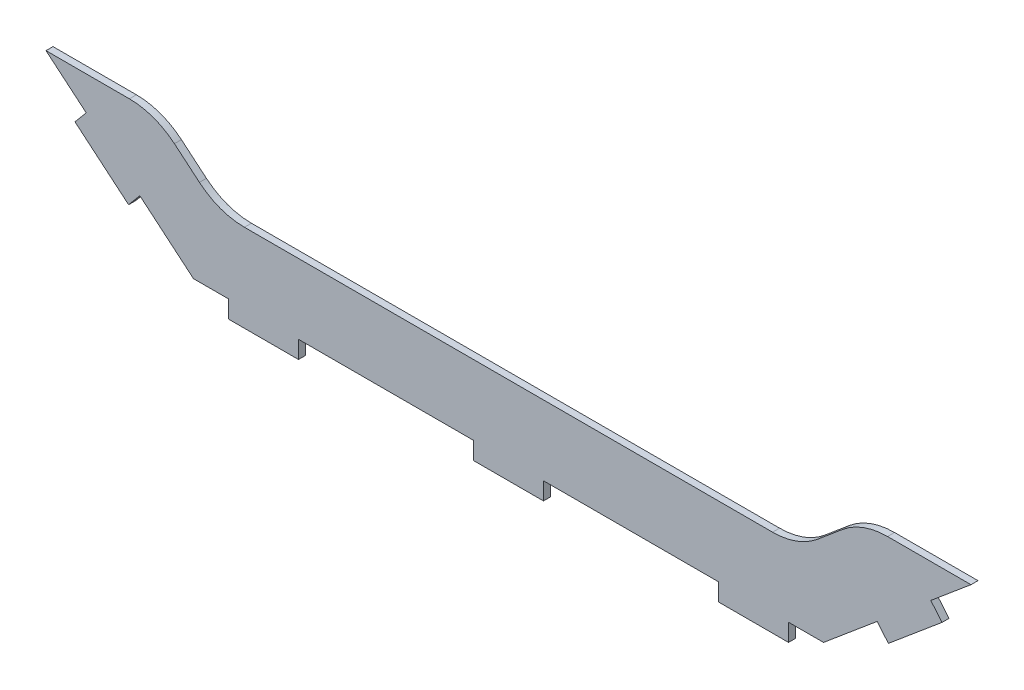
ISO-10303-21;
HEADER;
FILE_DESCRIPTION(('STEP AP214'),'2;1');
FILE_NAME('part.step','',(''),(''),'','','');
FILE_SCHEMA(('AUTOMOTIVE_DESIGN { 1 0 10303 214 1 1 1 1 }'));
ENDSEC;
DATA;
#1=APPLICATION_CONTEXT('core data for automotive mechanical design processes');
#2=APPLICATION_PROTOCOL_DEFINITION('international standard','automotive_design',2000,#1);
#3=PRODUCT_CONTEXT('',#1,'mechanical');
#4=PRODUCT('Part','Part','',(#3));
#5=PRODUCT_RELATED_PRODUCT_CATEGORY('part','',(#4));
#6=PRODUCT_DEFINITION_FORMATION('','',#4);
#7=PRODUCT_DEFINITION_CONTEXT('part definition',#1,'design');
#8=PRODUCT_DEFINITION('design','',#6,#7);
#9=PRODUCT_DEFINITION_SHAPE('','',#8);
#10=(LENGTH_UNIT() NAMED_UNIT(*) SI_UNIT(.MILLI.,.METRE.));
#11=(NAMED_UNIT(*) PLANE_ANGLE_UNIT() SI_UNIT($,.RADIAN.));
#12=(NAMED_UNIT(*) SI_UNIT($,.STERADIAN.) SOLID_ANGLE_UNIT());
#13=UNCERTAINTY_MEASURE_WITH_UNIT(LENGTH_MEASURE(1.E-05),#10,'distance_accuracy_value','');
#14=(GEOMETRIC_REPRESENTATION_CONTEXT(3) GLOBAL_UNCERTAINTY_ASSIGNED_CONTEXT((#13)) GLOBAL_UNIT_ASSIGNED_CONTEXT((#10,
#11,#12)) REPRESENTATION_CONTEXT('',''));
#15=CARTESIAN_POINT('',(0.,0.,0.));
#16=DIRECTION('',(0.,0.,1.));
#17=DIRECTION('',(1.,0.,0.));
#18=AXIS2_PLACEMENT_3D('',#15,#16,#17);
#19=CARTESIAN_POINT('',(0.5,-0.25,0.05));
#20=DIRECTION('',(-1.,0.,0.));
#21=DIRECTION('',(0.,0.,1.));
#22=AXIS2_PLACEMENT_3D('',#19,#20,#21);
#23=PLANE('',#22);
#24=DIRECTION('',(0.,1.,0.));
#25=VECTOR('',#24,1.);
#26=CARTESIAN_POINT('',(0.5,-0.25,-0.05));
#27=LINE('',#26,#25);
#28=CARTESIAN_POINT('',(0.5,-0.25,-0.05));
#29=VERTEX_POINT('',#28);
#30=CARTESIAN_POINT('',(0.5,0.,-0.05));
#31=VERTEX_POINT('',#30);
#32=EDGE_CURVE('E324',#29,#31,#27,.T.);
#33=ORIENTED_EDGE('',*,*,#32,.T.);
#34=DIRECTION('',(0.,0.,-1.));
#35=VECTOR('',#34,1.);
#36=CARTESIAN_POINT('',(0.5,0.,0.05));
#37=LINE('',#36,#35);
#38=CARTESIAN_POINT('',(0.5,0.,0.05));
#39=VERTEX_POINT('',#38);
#40=EDGE_CURVE('E303',#39,#31,#37,.T.);
#41=ORIENTED_EDGE('',*,*,#40,.F.);
#42=DIRECTION('',(0.,1.,0.));
#43=VECTOR('',#42,1.);
#44=CARTESIAN_POINT('',(0.5,-0.25,0.05));
#45=LINE('',#44,#43);
#46=CARTESIAN_POINT('',(0.5,-0.25,0.05));
#47=VERTEX_POINT('',#46);
#48=EDGE_CURVE('E310',#47,#39,#45,.T.);
#49=ORIENTED_EDGE('',*,*,#48,.F.);
#50=DIRECTION('',(0.,0.,-1.));
#51=VECTOR('',#50,1.);
#52=CARTESIAN_POINT('',(0.5,-0.25,0.05));
#53=LINE('',#52,#51);
#54=EDGE_CURVE('E454',#47,#29,#53,.T.);
#55=ORIENTED_EDGE('',*,*,#54,.T.);
#56=EDGE_LOOP('',(#33,#41,#49,#55));
#57=FACE_BOUND('',#56,.T.);
#58=ADVANCED_FACE('F39',(#57),#23,.F.);
#59=CARTESIAN_POINT('',(0.5,0.,0.05));
#60=DIRECTION('',(0.,1.,0.));
#61=DIRECTION('',(0.,0.,1.));
#62=AXIS2_PLACEMENT_3D('',#59,#60,#61);
#63=PLANE('',#62);
#64=DIRECTION('',(1.,0.,0.));
#65=VECTOR('',#64,1.);
#66=CARTESIAN_POINT('',(0.5,0.,-0.05));
#67=LINE('',#66,#65);
#68=CARTESIAN_POINT('',(3.,0.,-0.05));
#69=VERTEX_POINT('',#68);
#70=EDGE_CURVE('E456',#31,#69,#67,.T.);
#71=ORIENTED_EDGE('',*,*,#70,.T.);
#72=DIRECTION('',(0.,0.,-1.));
#73=VECTOR('',#72,1.);
#74=CARTESIAN_POINT('',(3.,0.,0.05));
#75=LINE('',#74,#73);
#76=CARTESIAN_POINT('',(3.,0.,0.05));
#77=VERTEX_POINT('',#76);
#78=EDGE_CURVE('E306',#77,#69,#75,.T.);
#79=ORIENTED_EDGE('',*,*,#78,.F.);
#80=DIRECTION('',(1.,0.,0.));
#81=VECTOR('',#80,1.);
#82=CARTESIAN_POINT('',(0.5,0.,0.05));
#83=LINE('',#82,#81);
#84=EDGE_CURVE('E299',#39,#77,#83,.T.);
#85=ORIENTED_EDGE('',*,*,#84,.F.);
#86=ORIENTED_EDGE('',*,*,#40,.T.);
#87=EDGE_LOOP('',(#71,#79,#85,#86));
#88=FACE_BOUND('',#87,.T.);
#89=ADVANCED_FACE('F301',(#88),#63,.F.);
#90=CARTESIAN_POINT('',(3.,0.,0.05));
#91=DIRECTION('',(1.,0.,0.));
#92=DIRECTION('',(0.,0.,-1.));
#93=AXIS2_PLACEMENT_3D('',#90,#91,#92);
#94=PLANE('',#93);
#95=DIRECTION('',(0.,-1.,0.));
#96=VECTOR('',#95,1.);
#97=CARTESIAN_POINT('',(3.,0.,-0.05));
#98=LINE('',#97,#96);
#99=CARTESIAN_POINT('',(3.,-0.25,-0.05));
#100=VERTEX_POINT('',#99);
#101=EDGE_CURVE('E459',#69,#100,#98,.T.);
#102=ORIENTED_EDGE('',*,*,#101,.T.);
#103=DIRECTION('',(0.,0.,-1.));
#104=VECTOR('',#103,1.);
#105=CARTESIAN_POINT('',(3.,-0.25,0.05));
#106=LINE('',#105,#104);
#107=CARTESIAN_POINT('',(3.,-0.25,0.05));
#108=VERTEX_POINT('',#107);
#109=EDGE_CURVE('E334',#108,#100,#106,.T.);
#110=ORIENTED_EDGE('',*,*,#109,.F.);
#111=DIRECTION('',(0.,-1.,0.));
#112=VECTOR('',#111,1.);
#113=CARTESIAN_POINT('',(3.,0.,0.05));
#114=LINE('',#113,#112);
#115=EDGE_CURVE('E309',#77,#108,#114,.T.);
#116=ORIENTED_EDGE('',*,*,#115,.F.);
#117=ORIENTED_EDGE('',*,*,#78,.T.);
#118=EDGE_LOOP('',(#102,#110,#116,#117));
#119=FACE_BOUND('',#118,.T.);
#120=ADVANCED_FACE('F701',(#119),#94,.F.);
#121=CARTESIAN_POINT('',(3.,-0.25,0.05));
#122=DIRECTION('',(0.,1.,0.));
#123=DIRECTION('',(0.,0.,1.));
#124=AXIS2_PLACEMENT_3D('',#121,#122,#123);
#125=PLANE('',#124);
#126=DIRECTION('',(1.,0.,0.));
#127=VECTOR('',#126,1.);
#128=CARTESIAN_POINT('',(3.,-0.25,-0.05));
#129=LINE('',#128,#127);
#130=CARTESIAN_POINT('',(4.,-0.25,-0.05));
#131=VERTEX_POINT('',#130);
#132=EDGE_CURVE('E462',#100,#131,#129,.T.);
#133=ORIENTED_EDGE('',*,*,#132,.T.);
#134=DIRECTION('',(0.,0.,-1.));
#135=VECTOR('',#134,1.);
#136=CARTESIAN_POINT('',(4.,-0.25,0.05));
#137=LINE('',#136,#135);
#138=CARTESIAN_POINT('',(4.,-0.25,0.05));
#139=VERTEX_POINT('',#138);
#140=EDGE_CURVE('E597',#139,#131,#137,.T.);
#141=ORIENTED_EDGE('',*,*,#140,.F.);
#142=DIRECTION('',(1.,0.,0.));
#143=VECTOR('',#142,1.);
#144=CARTESIAN_POINT('',(3.,-0.25,0.05));
#145=LINE('',#144,#143);
#146=EDGE_CURVE('E608',#108,#139,#145,.T.);
#147=ORIENTED_EDGE('',*,*,#146,.F.);
#148=ORIENTED_EDGE('',*,*,#109,.T.);
#149=EDGE_LOOP('',(#133,#141,#147,#148));
#150=FACE_BOUND('',#149,.T.);
#151=ADVANCED_FACE('F606',(#150),#125,.F.);
#152=CARTESIAN_POINT('',(4.,-0.25,0.05));
#153=DIRECTION('',(-1.,0.,0.));
#154=DIRECTION('',(0.,0.,1.));
#155=AXIS2_PLACEMENT_3D('',#152,#153,#154);
#156=PLANE('',#155);
#157=DIRECTION('',(0.,1.,0.));
#158=VECTOR('',#157,1.);
#159=CARTESIAN_POINT('',(4.,-0.25,-0.05));
#160=LINE('',#159,#158);
#161=CARTESIAN_POINT('',(4.,0.,-0.05));
#162=VERTEX_POINT('',#161);
#163=EDGE_CURVE('E465',#131,#162,#160,.T.);
#164=ORIENTED_EDGE('',*,*,#163,.T.);
#165=DIRECTION('',(0.,0.,-1.));
#166=VECTOR('',#165,1.);
#167=CARTESIAN_POINT('',(4.,0.,0.05));
#168=LINE('',#167,#166);
#169=CARTESIAN_POINT('',(4.,0.,0.05));
#170=VERTEX_POINT('',#169);
#171=EDGE_CURVE('E593',#170,#162,#168,.T.);
#172=ORIENTED_EDGE('',*,*,#171,.F.);
#173=DIRECTION('',(0.,1.,0.));
#174=VECTOR('',#173,1.);
#175=CARTESIAN_POINT('',(4.,-0.25,0.05));
#176=LINE('',#175,#174);
#177=EDGE_CURVE('E626',#139,#170,#176,.T.);
#178=ORIENTED_EDGE('',*,*,#177,.F.);
#179=ORIENTED_EDGE('',*,*,#140,.T.);
#180=EDGE_LOOP('',(#164,#172,#178,#179));
#181=FACE_BOUND('',#180,.T.);
#182=ADVANCED_FACE('F616',(#181),#156,.F.);
#183=CARTESIAN_POINT('',(4.,0.,0.05));
#184=DIRECTION('',(0.,1.,0.));
#185=DIRECTION('',(0.,0.,1.));
#186=AXIS2_PLACEMENT_3D('',#183,#184,#185);
#187=PLANE('',#186);
#188=DIRECTION('',(1.,0.,0.));
#189=VECTOR('',#188,1.);
#190=CARTESIAN_POINT('',(4.,0.,-0.05));
#191=LINE('',#190,#189);
#192=CARTESIAN_POINT('',(4.5,0.,-0.05));
#193=VERTEX_POINT('',#192);
#194=EDGE_CURVE('E468',#162,#193,#191,.T.);
#195=ORIENTED_EDGE('',*,*,#194,.T.);
#196=DIRECTION('',(0.,0.,-1.));
#197=VECTOR('',#196,1.);
#198=CARTESIAN_POINT('',(4.5,0.,0.05));
#199=LINE('',#198,#197);
#200=CARTESIAN_POINT('',(4.5,0.,0.05));
#201=VERTEX_POINT('',#200);
#202=EDGE_CURVE('E589',#201,#193,#199,.T.);
#203=ORIENTED_EDGE('',*,*,#202,.F.);
#204=DIRECTION('',(1.,0.,0.));
#205=VECTOR('',#204,1.);
#206=CARTESIAN_POINT('',(4.,0.,0.05));
#207=LINE('',#206,#205);
#208=EDGE_CURVE('E622',#170,#201,#207,.T.);
#209=ORIENTED_EDGE('',*,*,#208,.F.);
#210=ORIENTED_EDGE('',*,*,#171,.T.);
#211=EDGE_LOOP('',(#195,#203,#209,#210));
#212=FACE_BOUND('',#211,.T.);
#213=ADVANCED_FACE('F620',(#212),#187,.F.);
#214=CARTESIAN_POINT('',(4.5,0.,0.05));
#215=DIRECTION('',(-0.64278760968654,0.766044443118977,0.));
#216=DIRECTION('',(-0.766044443118977,-0.64278760968654,0.));
#217=AXIS2_PLACEMENT_3D('',#214,#215,#216);
#218=PLANE('',#217);
#219=DIRECTION('',(0.766044443118977,0.64278760968654,0.));
#220=VECTOR('',#219,1.);
#221=CARTESIAN_POINT('',(4.5,0.,-0.05));
#222=LINE('',#221,#220);
#223=CARTESIAN_POINT('',(5.26604444311898,0.642787609686539,-0.05));
#224=VERTEX_POINT('',#223);
#225=EDGE_CURVE('E471',#193,#224,#222,.T.);
#226=ORIENTED_EDGE('',*,*,#225,.T.);
#227=DIRECTION('',(0.,0.,-1.));
#228=VECTOR('',#227,1.);
#229=CARTESIAN_POINT('',(5.26604444311898,0.642787609686539,0.05));
#230=LINE('',#229,#228);
#231=CARTESIAN_POINT('',(5.26604444311898,0.642787609686539,0.05));
#232=VERTEX_POINT('',#231);
#233=EDGE_CURVE('E585',#232,#224,#230,.T.);
#234=ORIENTED_EDGE('',*,*,#233,.F.);
#235=DIRECTION('',(0.766044443118977,0.64278760968654,0.));
#236=VECTOR('',#235,1.);
#237=CARTESIAN_POINT('',(4.5,0.,0.05));
#238=LINE('',#237,#236);
#239=EDGE_CURVE('E625',#201,#232,#238,.T.);
#240=ORIENTED_EDGE('',*,*,#239,.F.);
#241=ORIENTED_EDGE('',*,*,#202,.T.);
#242=EDGE_LOOP('',(#226,#234,#240,#241));
#243=FACE_BOUND('',#242,.T.);
#244=ADVANCED_FACE('F687',(#243),#218,.F.);
#245=CARTESIAN_POINT('',(5.26604444311898,0.642787609686539,0.05));
#246=DIRECTION('',(0.766044443118977,0.642787609686541,0.));
#247=DIRECTION('',(-0.642787609686541,0.766044443118977,0.));
#248=AXIS2_PLACEMENT_3D('',#245,#246,#247);
#249=PLANE('',#248);
#250=DIRECTION('',(0.642787609686541,-0.766044443118977,0.));
#251=VECTOR('',#250,1.);
#252=CARTESIAN_POINT('',(5.26604444311898,0.642787609686539,-0.05));
#253=LINE('',#252,#251);
#254=CARTESIAN_POINT('',(5.42674134554061,0.451276498906795,-0.05));
#255=VERTEX_POINT('',#254);
#256=EDGE_CURVE('E474',#224,#255,#253,.T.);
#257=ORIENTED_EDGE('',*,*,#256,.T.);
#258=DIRECTION('',(0.,0.,-1.));
#259=VECTOR('',#258,1.);
#260=CARTESIAN_POINT('',(5.42674134554061,0.451276498906795,0.05));
#261=LINE('',#260,#259);
#262=CARTESIAN_POINT('',(5.42674134554061,0.451276498906795,0.05));
#263=VERTEX_POINT('',#262);
#264=EDGE_CURVE('E581',#263,#255,#261,.T.);
#265=ORIENTED_EDGE('',*,*,#264,.F.);
#266=DIRECTION('',(0.642787609686541,-0.766044443118977,0.));
#267=VECTOR('',#266,1.);
#268=CARTESIAN_POINT('',(5.26604444311898,0.642787609686539,0.05));
#269=LINE('',#268,#267);
#270=EDGE_CURVE('E629',#232,#263,#269,.T.);
#271=ORIENTED_EDGE('',*,*,#270,.F.);
#272=ORIENTED_EDGE('',*,*,#233,.T.);
#273=EDGE_LOOP('',(#257,#265,#271,#272));
#274=FACE_BOUND('',#273,.T.);
#275=ADVANCED_FACE('F684',(#274),#249,.F.);
#276=CARTESIAN_POINT('',(5.42674134554061,0.451276498906795,0.05));
#277=DIRECTION('',(-0.64278760968654,0.766044443118977,0.));
#278=DIRECTION('',(-0.766044443118977,-0.64278760968654,0.));
#279=AXIS2_PLACEMENT_3D('',#276,#277,#278);
#280=PLANE('',#279);
#281=DIRECTION('',(0.766044443118977,0.64278760968654,0.));
#282=VECTOR('',#281,1.);
#283=CARTESIAN_POINT('',(5.42674134554061,0.451276498906795,-0.05));
#284=LINE('',#283,#282);
#285=CARTESIAN_POINT('',(6.19278578865959,1.09406410859334,-0.05));
#286=VERTEX_POINT('',#285);
#287=EDGE_CURVE('E477',#255,#286,#284,.T.);
#288=ORIENTED_EDGE('',*,*,#287,.T.);
#289=DIRECTION('',(0.,0.,-1.));
#290=VECTOR('',#289,1.);
#291=CARTESIAN_POINT('',(6.19278578865959,1.09406410859334,0.05));
#292=LINE('',#291,#290);
#293=CARTESIAN_POINT('',(6.19278578865959,1.09406410859334,0.05));
#294=VERTEX_POINT('',#293);
#295=EDGE_CURVE('E577',#294,#286,#292,.T.);
#296=ORIENTED_EDGE('',*,*,#295,.F.);
#297=DIRECTION('',(0.766044443118977,0.64278760968654,0.));
#298=VECTOR('',#297,1.);
#299=CARTESIAN_POINT('',(5.42674134554061,0.451276498906795,0.05));
#300=LINE('',#299,#298);
#301=EDGE_CURVE('E637',#263,#294,#300,.T.);
#302=ORIENTED_EDGE('',*,*,#301,.F.);
#303=ORIENTED_EDGE('',*,*,#264,.T.);
#304=EDGE_LOOP('',(#288,#296,#302,#303));
#305=FACE_BOUND('',#304,.T.);
#306=ADVANCED_FACE('F680',(#305),#280,.F.);
#307=CARTESIAN_POINT('',(6.19278578865959,1.09406410859334,0.05));
#308=DIRECTION('',(-0.766044443118978,-0.64278760968654,0.));
#309=DIRECTION('',(0.64278760968654,-0.766044443118978,0.));
#310=AXIS2_PLACEMENT_3D('',#307,#308,#309);
#311=PLANE('',#310);
#312=DIRECTION('',(-0.64278760968654,0.766044443118978,0.));
#313=VECTOR('',#312,1.);
#314=CARTESIAN_POINT('',(6.19278578865959,1.09406410859334,-0.05));
#315=LINE('',#314,#313);
#316=CARTESIAN_POINT('',(6.03208888623795,1.28557521937308,-0.05));
#317=VERTEX_POINT('',#316);
#318=EDGE_CURVE('E480',#286,#317,#315,.T.);
#319=ORIENTED_EDGE('',*,*,#318,.T.);
#320=DIRECTION('',(0.,0.,-1.));
#321=VECTOR('',#320,1.);
#322=CARTESIAN_POINT('',(6.03208888623795,1.28557521937308,0.05));
#323=LINE('',#322,#321);
#324=CARTESIAN_POINT('',(6.03208888623795,1.28557521937308,0.05));
#325=VERTEX_POINT('',#324);
#326=EDGE_CURVE('E573',#325,#317,#323,.T.);
#327=ORIENTED_EDGE('',*,*,#326,.F.);
#328=DIRECTION('',(-0.64278760968654,0.766044443118978,0.));
#329=VECTOR('',#328,1.);
#330=CARTESIAN_POINT('',(6.19278578865959,1.09406410859334,0.05));
#331=LINE('',#330,#329);
#332=EDGE_CURVE('E640',#294,#325,#331,.T.);
#333=ORIENTED_EDGE('',*,*,#332,.F.);
#334=ORIENTED_EDGE('',*,*,#295,.T.);
#335=EDGE_LOOP('',(#319,#327,#333,#334));
#336=FACE_BOUND('',#335,.T.);
#337=ADVANCED_FACE('F675',(#336),#311,.F.);
#338=CARTESIAN_POINT('',(6.03208888623795,1.28557521937308,0.05));
#339=DIRECTION('',(-0.642787609686542,0.766044443118976,0.));
#340=DIRECTION('',(-0.766044443118976,-0.642787609686542,0.));
#341=AXIS2_PLACEMENT_3D('',#338,#339,#340);
#342=PLANE('',#341);
#343=DIRECTION('',(0.766044443118976,0.642787609686542,0.));
#344=VECTOR('',#343,1.);
#345=CARTESIAN_POINT('',(6.03208888623795,1.28557521937308,-0.05));
#346=LINE('',#345,#344);
#347=CARTESIAN_POINT('',(6.60662221857719,1.76766592663799,-0.05));
#348=VERTEX_POINT('',#347);
#349=EDGE_CURVE('E482',#317,#348,#346,.T.);
#350=ORIENTED_EDGE('',*,*,#349,.T.);
#351=DIRECTION('',(0.,0.,-1.));
#352=VECTOR('',#351,1.);
#353=CARTESIAN_POINT('',(6.60662221857719,1.76766592663799,0.05));
#354=LINE('',#353,#352);
#355=CARTESIAN_POINT('',(6.60662221857719,1.76766592663799,0.05));
#356=VERTEX_POINT('',#355);
#357=EDGE_CURVE('E569',#356,#348,#354,.T.);
#358=ORIENTED_EDGE('',*,*,#357,.F.);
#359=DIRECTION('',(0.766044443118976,0.642787609686542,0.));
#360=VECTOR('',#359,1.);
#361=CARTESIAN_POINT('',(6.03208888623795,1.28557521937308,0.05));
#362=LINE('',#361,#360);
#363=EDGE_CURVE('E643',#325,#356,#362,.T.);
#364=ORIENTED_EDGE('',*,*,#363,.F.);
#365=ORIENTED_EDGE('',*,*,#326,.T.);
#366=EDGE_LOOP('',(#350,#358,#364,#365));
#367=FACE_BOUND('',#366,.T.);
#368=ADVANCED_FACE('F669',(#367),#342,.F.);
#369=CARTESIAN_POINT('',(6.60662221857719,1.76766592663799,0.05));
#370=DIRECTION('',(0.,-1.,0.));
#371=DIRECTION('',(0.,0.,-1.));
#372=AXIS2_PLACEMENT_3D('',#369,#370,#371);
#373=PLANE('',#372);
#374=DIRECTION('',(-1.,0.,0.));
#375=VECTOR('',#374,1.);
#376=CARTESIAN_POINT('',(6.60662221857719,1.76766592663799,-0.05));
#377=LINE('',#376,#375);
#378=CARTESIAN_POINT('',(5.41486862598298,1.76766592663799,-0.05));
#379=VERTEX_POINT('',#378);
#380=EDGE_CURVE('E485',#348,#379,#377,.T.);
#381=ORIENTED_EDGE('',*,*,#380,.T.);
#382=DIRECTION('',(0.,0.,-1.));
#383=VECTOR('',#382,1.);
#384=CARTESIAN_POINT('',(5.41486862598298,1.76766592663799,0.05));
#385=LINE('',#384,#383);
#386=CARTESIAN_POINT('',(5.41486862598298,1.76766592663799,0.05));
#387=VERTEX_POINT('',#386);
#388=EDGE_CURVE('E354',#379,#387,#385,.F.);
#389=ORIENTED_EDGE('',*,*,#388,.T.);
#390=DIRECTION('',(-1.,0.,0.));
#391=VECTOR('',#390,1.);
#392=CARTESIAN_POINT('',(6.60662221857719,1.76766592663799,0.05));
#393=LINE('',#392,#391);
#394=EDGE_CURVE('E645',#356,#387,#393,.T.);
#395=ORIENTED_EDGE('',*,*,#394,.F.);
#396=ORIENTED_EDGE('',*,*,#357,.T.);
#397=EDGE_LOOP('',(#381,#389,#395,#396));
#398=FACE_BOUND('',#397,.T.);
#399=ADVANCED_FACE('F664',(#398),#373,.F.);
#400=CARTESIAN_POINT('',(5.05089839171678,1.76766592663799,0.05));
#401=DIRECTION('',(0.642787609686541,-0.766044443118977,0.));
#402=DIRECTION('',(0.766044443118977,0.642787609686541,0.));
#403=AXIS2_PLACEMENT_3D('',#400,#401,#402);
#404=PLANE('',#403);
#405=DIRECTION('',(-0.766044443118977,-0.64278760968654,0.));
#406=VECTOR('',#405,1.);
#407=CARTESIAN_POINT('',(5.05089839171678,1.76766592663799,-0.05));
#408=LINE('',#407,#406);
#409=CARTESIAN_POINT('',(4.77208101629644,1.53371036975696,-0.05));
#410=VERTEX_POINT('',#409);
#411=CARTESIAN_POINT('',(4.41484714115413,1.23395555688102,-0.05));
#412=VERTEX_POINT('',#411);
#413=EDGE_CURVE('E397',#410,#412,#408,.T.);
#414=ORIENTED_EDGE('',*,*,#413,.T.);
#415=DIRECTION('',(0.,0.,-1.));
#416=VECTOR('',#415,1.);
#417=CARTESIAN_POINT('',(4.41484714115413,1.23395555688102,0.05));
#418=LINE('',#417,#416);
#419=CARTESIAN_POINT('',(4.41484714115413,1.23395555688102,0.05));
#420=VERTEX_POINT('',#419);
#421=EDGE_CURVE('E345',#412,#420,#418,.F.);
#422=ORIENTED_EDGE('',*,*,#421,.T.);
#423=DIRECTION('',(-0.766044443118977,-0.64278760968654,0.));
#424=VECTOR('',#423,1.);
#425=CARTESIAN_POINT('',(5.05089839171678,1.76766592663799,0.05));
#426=LINE('',#425,#424);
#427=CARTESIAN_POINT('',(4.77208101629644,1.53371036975696,0.05));
#428=VERTEX_POINT('',#427);
#429=EDGE_CURVE('E413',#428,#420,#426,.T.);
#430=ORIENTED_EDGE('',*,*,#429,.F.);
#431=DIRECTION('',(0.,0.,-1.));
#432=VECTOR('',#431,1.);
#433=CARTESIAN_POINT('',(4.77208101629644,1.53371036975696,0.05));
#434=LINE('',#433,#432);
#435=EDGE_CURVE('E341',#428,#410,#434,.T.);
#436=ORIENTED_EDGE('',*,*,#435,.T.);
#437=EDGE_LOOP('',(#414,#422,#430,#436));
#438=FACE_BOUND('',#437,.T.);
#439=ADVANCED_FACE('F657',(#438),#404,.F.);
#440=CARTESIAN_POINT('',(4.1360297657338,1.,0.05));
#441=DIRECTION('',(0.,-1.,0.));
#442=DIRECTION('',(1.,0.,0.));
#443=AXIS2_PLACEMENT_3D('',#440,#441,#442);
#444=PLANE('',#443);
#445=DIRECTION('',(-1.,0.,0.));
#446=VECTOR('',#445,1.);
#447=CARTESIAN_POINT('',(4.1360297657338,1.,0.05));
#448=LINE('',#447,#446);
#449=CARTESIAN_POINT('',(3.77205953146759,1.,0.05));
#450=VERTEX_POINT('',#449);
#451=CARTESIAN_POINT('',(-3.77205953146759,0.999999999999999,0.05));
#452=VERTEX_POINT('',#451);
#453=EDGE_CURVE('E406',#450,#452,#448,.T.);
#454=ORIENTED_EDGE('',*,*,#453,.F.);
#455=DIRECTION('',(0.,0.,-1.));
#456=VECTOR('',#455,1.);
#457=CARTESIAN_POINT('',(3.77205953146759,1.,-0.05));
#458=LINE('',#457,#456);
#459=CARTESIAN_POINT('',(3.77205953146759,1.,-0.05));
#460=VERTEX_POINT('',#459);
#461=EDGE_CURVE('E331',#450,#460,#458,.T.);
#462=ORIENTED_EDGE('',*,*,#461,.T.);
#463=DIRECTION('',(-1.,0.,0.));
#464=VECTOR('',#463,1.);
#465=CARTESIAN_POINT('',(4.1360297657338,1.,-0.05));
#466=LINE('',#465,#464);
#467=CARTESIAN_POINT('',(-3.77205953146759,0.999999999999999,-0.05));
#468=VERTEX_POINT('',#467);
#469=EDGE_CURVE('E387',#460,#468,#466,.T.);
#470=ORIENTED_EDGE('',*,*,#469,.T.);
#471=DIRECTION('',(0.,0.,-1.));
#472=VECTOR('',#471,1.);
#473=CARTESIAN_POINT('',(-3.77205953146759,0.999999999999999,0.05));
#474=LINE('',#473,#472);
#475=EDGE_CURVE('E326',#468,#452,#474,.F.);
#476=ORIENTED_EDGE('',*,*,#475,.T.);
#477=EDGE_LOOP('',(#454,#462,#470,#476));
#478=FACE_BOUND('',#477,.T.);
#479=ADVANCED_FACE('F395',(#478),#444,.F.);
#480=CARTESIAN_POINT('',(-5.05089839171678,1.76766592663798,0.05));
#481=DIRECTION('',(0.64278760968654,0.766044443118978,0.));
#482=DIRECTION('',(-0.766044443118978,0.64278760968654,0.));
#483=AXIS2_PLACEMENT_3D('',#480,#481,#482);
#484=PLANE('',#483);
#485=DIRECTION('',(0.766044443118978,-0.64278760968654,0.));
#486=VECTOR('',#485,1.);
#487=CARTESIAN_POINT('',(-5.05089839171678,1.76766592663798,0.05));
#488=LINE('',#487,#486);
#489=CARTESIAN_POINT('',(-4.77208101629644,1.53371036975696,0.05));
#490=VERTEX_POINT('',#489);
#491=CARTESIAN_POINT('',(-4.41484714115413,1.23395555688102,0.05));
#492=VERTEX_POINT('',#491);
#493=EDGE_CURVE('E403',#490,#492,#488,.T.);
#494=ORIENTED_EDGE('',*,*,#493,.T.);
#495=DIRECTION('',(0.,0.,-1.));
#496=VECTOR('',#495,1.);
#497=CARTESIAN_POINT('',(-4.41484714115413,1.23395555688102,0.05));
#498=LINE('',#497,#496);
#499=CARTESIAN_POINT('',(-4.41484714115413,1.23395555688102,-0.05));
#500=VERTEX_POINT('',#499);
#501=EDGE_CURVE('E365',#492,#500,#498,.T.);
#502=ORIENTED_EDGE('',*,*,#501,.T.);
#503=DIRECTION('',(0.766044443118978,-0.64278760968654,0.));
#504=VECTOR('',#503,1.);
#505=CARTESIAN_POINT('',(-5.05089839171678,1.76766592663798,-0.05));
#506=LINE('',#505,#504);
#507=CARTESIAN_POINT('',(-4.77208101629644,1.53371036975696,-0.05));
#508=VERTEX_POINT('',#507);
#509=EDGE_CURVE('E389',#508,#500,#506,.T.);
#510=ORIENTED_EDGE('',*,*,#509,.F.);
#511=DIRECTION('',(0.,0.,-1.));
#512=VECTOR('',#511,1.);
#513=CARTESIAN_POINT('',(-4.77208101629644,1.53371036975696,0.05));
#514=LINE('',#513,#512);
#515=EDGE_CURVE('E362',#508,#490,#514,.F.);
#516=ORIENTED_EDGE('',*,*,#515,.T.);
#517=EDGE_LOOP('',(#494,#502,#510,#516));
#518=FACE_BOUND('',#517,.T.);
#519=ADVANCED_FACE('F401',(#518),#484,.T.);
#520=CARTESIAN_POINT('',(-6.60662221857719,1.76766592663798,0.05));
#521=DIRECTION('',(0.,1.,0.));
#522=DIRECTION('',(-1.,0.,0.));
#523=AXIS2_PLACEMENT_3D('',#520,#521,#522);
#524=PLANE('',#523);
#525=DIRECTION('',(1.,0.,0.));
#526=VECTOR('',#525,1.);
#527=CARTESIAN_POINT('',(-6.60662221857719,1.76766592663798,0.05));
#528=LINE('',#527,#526);
#529=CARTESIAN_POINT('',(-6.60662221857719,1.76766592663798,0.05));
#530=VERTEX_POINT('',#529);
#531=CARTESIAN_POINT('',(-5.41486862598298,1.76766592663798,0.05));
#532=VERTEX_POINT('',#531);
#533=EDGE_CURVE('E405',#530,#532,#528,.T.);
#534=ORIENTED_EDGE('',*,*,#533,.T.);
#535=DIRECTION('',(0.,0.,-1.));
#536=VECTOR('',#535,1.);
#537=CARTESIAN_POINT('',(-5.41486862598298,1.76766592663798,0.05));
#538=LINE('',#537,#536);
#539=CARTESIAN_POINT('',(-5.41486862598298,1.76766592663798,-0.05));
#540=VERTEX_POINT('',#539);
#541=EDGE_CURVE('E369',#532,#540,#538,.T.);
#542=ORIENTED_EDGE('',*,*,#541,.T.);
#543=DIRECTION('',(1.,0.,0.));
#544=VECTOR('',#543,1.);
#545=CARTESIAN_POINT('',(-6.60662221857719,1.76766592663798,-0.05));
#546=LINE('',#545,#544);
#547=CARTESIAN_POINT('',(-6.60662221857719,1.76766592663798,-0.05));
#548=VERTEX_POINT('',#547);
#549=EDGE_CURVE('E494',#548,#540,#546,.T.);
#550=ORIENTED_EDGE('',*,*,#549,.F.);
#551=DIRECTION('',(0.,0.,-1.));
#552=VECTOR('',#551,1.);
#553=CARTESIAN_POINT('',(-6.60662221857719,1.76766592663798,0.05));
#554=LINE('',#553,#552);
#555=EDGE_CURVE('E566',#530,#548,#554,.T.);
#556=ORIENTED_EDGE('',*,*,#555,.F.);
#557=EDGE_LOOP('',(#534,#542,#550,#556));
#558=FACE_BOUND('',#557,.T.);
#559=ADVANCED_FACE('F718',(#558),#524,.T.);
#560=CARTESIAN_POINT('',(-6.03208888623795,1.28557521937308,0.05));
#561=DIRECTION('',(-0.64278760968654,-0.766044443118977,0.));
#562=DIRECTION('',(0.766044443118977,-0.64278760968654,0.));
#563=AXIS2_PLACEMENT_3D('',#560,#561,#562);
#564=PLANE('',#563);
#565=DIRECTION('',(-0.766044443118977,0.64278760968654,0.));
#566=VECTOR('',#565,1.);
#567=CARTESIAN_POINT('',(-6.03208888623795,1.28557521937308,-0.05));
#568=LINE('',#567,#566);
#569=CARTESIAN_POINT('',(-6.03208888623795,1.28557521937308,-0.05));
#570=VERTEX_POINT('',#569);
#571=EDGE_CURVE('E498',#570,#548,#568,.T.);
#572=ORIENTED_EDGE('',*,*,#571,.F.);
#573=DIRECTION('',(0.,0.,-1.));
#574=VECTOR('',#573,1.);
#575=CARTESIAN_POINT('',(-6.03208888623795,1.28557521937308,0.05));
#576=LINE('',#575,#574);
#577=CARTESIAN_POINT('',(-6.03208888623795,1.28557521937308,0.05));
#578=VERTEX_POINT('',#577);
#579=EDGE_CURVE('E563',#578,#570,#576,.T.);
#580=ORIENTED_EDGE('',*,*,#579,.F.);
#581=DIRECTION('',(-0.766044443118977,0.64278760968654,0.));
#582=VECTOR('',#581,1.);
#583=CARTESIAN_POINT('',(-6.03208888623795,1.28557521937308,0.05));
#584=LINE('',#583,#582);
#585=EDGE_CURVE('E410',#578,#530,#584,.T.);
#586=ORIENTED_EDGE('',*,*,#585,.T.);
#587=ORIENTED_EDGE('',*,*,#555,.T.);
#588=EDGE_LOOP('',(#572,#580,#586,#587));
#589=FACE_BOUND('',#588,.T.);
#590=ADVANCED_FACE('F722',(#589),#564,.T.);
#591=CARTESIAN_POINT('',(-6.19278578865959,1.09406410859333,0.05));
#592=DIRECTION('',(-0.766044443118977,0.64278760968654,0.));
#593=DIRECTION('',(-0.64278760968654,-0.766044443118978,0.));
#594=AXIS2_PLACEMENT_3D('',#591,#592,#593);
#595=PLANE('',#594);
#596=DIRECTION('',(0.64278760968654,0.766044443118977,0.));
#597=VECTOR('',#596,1.);
#598=CARTESIAN_POINT('',(-6.19278578865959,1.09406410859333,-0.05));
#599=LINE('',#598,#597);
#600=CARTESIAN_POINT('',(-6.19278578865959,1.09406410859333,-0.05));
#601=VERTEX_POINT('',#600);
#602=EDGE_CURVE('E502',#601,#570,#599,.T.);
#603=ORIENTED_EDGE('',*,*,#602,.F.);
#604=DIRECTION('',(0.,0.,-1.));
#605=VECTOR('',#604,1.);
#606=CARTESIAN_POINT('',(-6.19278578865959,1.09406410859333,0.05));
#607=LINE('',#606,#605);
#608=CARTESIAN_POINT('',(-6.19278578865959,1.09406410859333,0.05));
#609=VERTEX_POINT('',#608);
#610=EDGE_CURVE('E560',#609,#601,#607,.T.);
#611=ORIENTED_EDGE('',*,*,#610,.F.);
#612=DIRECTION('',(0.64278760968654,0.766044443118977,0.));
#613=VECTOR('',#612,1.);
#614=CARTESIAN_POINT('',(-6.19278578865959,1.09406410859333,0.05));
#615=LINE('',#614,#613);
#616=EDGE_CURVE('E420',#609,#578,#615,.T.);
#617=ORIENTED_EDGE('',*,*,#616,.T.);
#618=ORIENTED_EDGE('',*,*,#579,.T.);
#619=EDGE_LOOP('',(#603,#611,#617,#618));
#620=FACE_BOUND('',#619,.T.);
#621=ADVANCED_FACE('F727',(#620),#595,.T.);
#622=CARTESIAN_POINT('',(-5.42674134554061,0.451276498906795,0.05));
#623=DIRECTION('',(-0.64278760968654,-0.766044443118977,0.));
#624=DIRECTION('',(0.766044443118977,-0.64278760968654,0.));
#625=AXIS2_PLACEMENT_3D('',#622,#623,#624);
#626=PLANE('',#625);
#627=DIRECTION('',(-0.766044443118977,0.64278760968654,0.));
#628=VECTOR('',#627,1.);
#629=CARTESIAN_POINT('',(-5.42674134554061,0.451276498906795,-0.05));
#630=LINE('',#629,#628);
#631=CARTESIAN_POINT('',(-5.42674134554061,0.451276498906795,-0.05));
#632=VERTEX_POINT('',#631);
#633=EDGE_CURVE('E506',#632,#601,#630,.T.);
#634=ORIENTED_EDGE('',*,*,#633,.F.);
#635=DIRECTION('',(0.,0.,-1.));
#636=VECTOR('',#635,1.);
#637=CARTESIAN_POINT('',(-5.42674134554061,0.451276498906795,0.05));
#638=LINE('',#637,#636);
#639=CARTESIAN_POINT('',(-5.42674134554061,0.451276498906795,0.05));
#640=VERTEX_POINT('',#639);
#641=EDGE_CURVE('E558',#640,#632,#638,.T.);
#642=ORIENTED_EDGE('',*,*,#641,.F.);
#643=DIRECTION('',(-0.766044443118977,0.64278760968654,0.));
#644=VECTOR('',#643,1.);
#645=CARTESIAN_POINT('',(-5.42674134554061,0.451276498906795,0.05));
#646=LINE('',#645,#644);
#647=EDGE_CURVE('E424',#640,#609,#646,.T.);
#648=ORIENTED_EDGE('',*,*,#647,.T.);
#649=ORIENTED_EDGE('',*,*,#610,.T.);
#650=EDGE_LOOP('',(#634,#642,#648,#649));
#651=FACE_BOUND('',#650,.T.);
#652=ADVANCED_FACE('F730',(#651),#626,.T.);
#653=CARTESIAN_POINT('',(-5.26604444311898,0.642787609686539,0.05));
#654=DIRECTION('',(0.766044443118978,-0.64278760968654,0.));
#655=DIRECTION('',(0.64278760968654,0.766044443118978,0.));
#656=AXIS2_PLACEMENT_3D('',#653,#654,#655);
#657=PLANE('',#656);
#658=DIRECTION('',(-0.64278760968654,-0.766044443118978,0.));
#659=VECTOR('',#658,1.);
#660=CARTESIAN_POINT('',(-5.26604444311898,0.642787609686539,-0.05));
#661=LINE('',#660,#659);
#662=CARTESIAN_POINT('',(-5.26604444311898,0.642787609686539,-0.05));
#663=VERTEX_POINT('',#662);
#664=EDGE_CURVE('E510',#663,#632,#661,.T.);
#665=ORIENTED_EDGE('',*,*,#664,.F.);
#666=DIRECTION('',(0.,0.,-1.));
#667=VECTOR('',#666,1.);
#668=CARTESIAN_POINT('',(-5.26604444311898,0.642787609686539,0.05));
#669=LINE('',#668,#667);
#670=CARTESIAN_POINT('',(-5.26604444311898,0.642787609686539,0.05));
#671=VERTEX_POINT('',#670);
#672=EDGE_CURVE('E556',#671,#663,#669,.T.);
#673=ORIENTED_EDGE('',*,*,#672,.F.);
#674=DIRECTION('',(-0.64278760968654,-0.766044443118978,0.));
#675=VECTOR('',#674,1.);
#676=CARTESIAN_POINT('',(-5.26604444311898,0.642787609686539,0.05));
#677=LINE('',#676,#675);
#678=EDGE_CURVE('E428',#671,#640,#677,.T.);
#679=ORIENTED_EDGE('',*,*,#678,.T.);
#680=ORIENTED_EDGE('',*,*,#641,.T.);
#681=EDGE_LOOP('',(#665,#673,#679,#680));
#682=FACE_BOUND('',#681,.T.);
#683=ADVANCED_FACE('F735',(#682),#657,.T.);
#684=CARTESIAN_POINT('',(-4.5,0.,0.05));
#685=DIRECTION('',(-0.64278760968654,-0.766044443118977,0.));
#686=DIRECTION('',(0.766044443118977,-0.64278760968654,0.));
#687=AXIS2_PLACEMENT_3D('',#684,#685,#686);
#688=PLANE('',#687);
#689=DIRECTION('',(-0.766044443118977,0.64278760968654,0.));
#690=VECTOR('',#689,1.);
#691=CARTESIAN_POINT('',(-4.5,0.,-0.05));
#692=LINE('',#691,#690);
#693=CARTESIAN_POINT('',(-4.5,0.,-0.05));
#694=VERTEX_POINT('',#693);
#695=EDGE_CURVE('E513',#694,#663,#692,.T.);
#696=ORIENTED_EDGE('',*,*,#695,.F.);
#697=DIRECTION('',(0.,0.,-1.));
#698=VECTOR('',#697,1.);
#699=CARTESIAN_POINT('',(-4.5,0.,0.05));
#700=LINE('',#699,#698);
#701=CARTESIAN_POINT('',(-4.5,0.,0.05));
#702=VERTEX_POINT('',#701);
#703=EDGE_CURVE('E554',#702,#694,#700,.T.);
#704=ORIENTED_EDGE('',*,*,#703,.F.);
#705=DIRECTION('',(-0.766044443118977,0.64278760968654,0.));
#706=VECTOR('',#705,1.);
#707=CARTESIAN_POINT('',(-4.5,0.,0.05));
#708=LINE('',#707,#706);
#709=EDGE_CURVE('E431',#702,#671,#708,.T.);
#710=ORIENTED_EDGE('',*,*,#709,.T.);
#711=ORIENTED_EDGE('',*,*,#672,.T.);
#712=EDGE_LOOP('',(#696,#704,#710,#711));
#713=FACE_BOUND('',#712,.T.);
#714=ADVANCED_FACE('F738',(#713),#688,.T.);
#715=CARTESIAN_POINT('',(-4.,0.,0.05));
#716=DIRECTION('',(0.,-1.,0.));
#717=DIRECTION('',(1.,0.,0.));
#718=AXIS2_PLACEMENT_3D('',#715,#716,#717);
#719=PLANE('',#718);
#720=DIRECTION('',(-1.,0.,0.));
#721=VECTOR('',#720,1.);
#722=CARTESIAN_POINT('',(-4.,0.,-0.05));
#723=LINE('',#722,#721);
#724=CARTESIAN_POINT('',(-4.,0.,-0.05));
#725=VERTEX_POINT('',#724);
#726=EDGE_CURVE('E516',#725,#694,#723,.T.);
#727=ORIENTED_EDGE('',*,*,#726,.F.);
#728=DIRECTION('',(0.,0.,-1.));
#729=VECTOR('',#728,1.);
#730=CARTESIAN_POINT('',(-4.,0.,0.05));
#731=LINE('',#730,#729);
#732=CARTESIAN_POINT('',(-4.,0.,0.05));
#733=VERTEX_POINT('',#732);
#734=EDGE_CURVE('E552',#733,#725,#731,.T.);
#735=ORIENTED_EDGE('',*,*,#734,.F.);
#736=DIRECTION('',(-1.,0.,0.));
#737=VECTOR('',#736,1.);
#738=CARTESIAN_POINT('',(-4.,0.,0.05));
#739=LINE('',#738,#737);
#740=EDGE_CURVE('E434',#733,#702,#739,.T.);
#741=ORIENTED_EDGE('',*,*,#740,.T.);
#742=ORIENTED_EDGE('',*,*,#703,.T.);
#743=EDGE_LOOP('',(#727,#735,#741,#742));
#744=FACE_BOUND('',#743,.T.);
#745=ADVANCED_FACE('F743',(#744),#719,.T.);
#746=CARTESIAN_POINT('',(-4.,-0.25,0.05));
#747=DIRECTION('',(-1.,0.,0.));
#748=DIRECTION('',(0.,0.,1.));
#749=AXIS2_PLACEMENT_3D('',#746,#747,#748);
#750=PLANE('',#749);
#751=DIRECTION('',(0.,1.,0.));
#752=VECTOR('',#751,1.);
#753=CARTESIAN_POINT('',(-4.,-0.25,-0.05));
#754=LINE('',#753,#752);
#755=CARTESIAN_POINT('',(-4.,-0.25,-0.05));
#756=VERTEX_POINT('',#755);
#757=EDGE_CURVE('E519',#756,#725,#754,.T.);
#758=ORIENTED_EDGE('',*,*,#757,.F.);
#759=DIRECTION('',(0.,0.,-1.));
#760=VECTOR('',#759,1.);
#761=CARTESIAN_POINT('',(-4.,-0.25,0.05));
#762=LINE('',#761,#760);
#763=CARTESIAN_POINT('',(-4.,-0.25,0.05));
#764=VERTEX_POINT('',#763);
#765=EDGE_CURVE('E550',#764,#756,#762,.T.);
#766=ORIENTED_EDGE('',*,*,#765,.F.);
#767=DIRECTION('',(0.,1.,0.));
#768=VECTOR('',#767,1.);
#769=CARTESIAN_POINT('',(-4.,-0.25,0.05));
#770=LINE('',#769,#768);
#771=EDGE_CURVE('E437',#764,#733,#770,.T.);
#772=ORIENTED_EDGE('',*,*,#771,.T.);
#773=ORIENTED_EDGE('',*,*,#734,.T.);
#774=EDGE_LOOP('',(#758,#766,#772,#773));
#775=FACE_BOUND('',#774,.T.);
#776=ADVANCED_FACE('F746',(#775),#750,.T.);
#777=CARTESIAN_POINT('',(-3.,-0.25,0.05));
#778=DIRECTION('',(0.,-1.,0.));
#779=DIRECTION('',(1.,0.,0.));
#780=AXIS2_PLACEMENT_3D('',#777,#778,#779);
#781=PLANE('',#780);
#782=DIRECTION('',(-1.,0.,0.));
#783=VECTOR('',#782,1.);
#784=CARTESIAN_POINT('',(-3.,-0.25,-0.05));
#785=LINE('',#784,#783);
#786=CARTESIAN_POINT('',(-3.,-0.25,-0.05));
#787=VERTEX_POINT('',#786);
#788=EDGE_CURVE('E522',#787,#756,#785,.T.);
#789=ORIENTED_EDGE('',*,*,#788,.F.);
#790=DIRECTION('',(0.,0.,-1.));
#791=VECTOR('',#790,1.);
#792=CARTESIAN_POINT('',(-3.,-0.25,0.05));
#793=LINE('',#792,#791);
#794=CARTESIAN_POINT('',(-3.,-0.25,0.05));
#795=VERTEX_POINT('',#794);
#796=EDGE_CURVE('E548',#795,#787,#793,.T.);
#797=ORIENTED_EDGE('',*,*,#796,.F.);
#798=DIRECTION('',(-1.,0.,0.));
#799=VECTOR('',#798,1.);
#800=CARTESIAN_POINT('',(-3.,-0.25,0.05));
#801=LINE('',#800,#799);
#802=EDGE_CURVE('E440',#795,#764,#801,.T.);
#803=ORIENTED_EDGE('',*,*,#802,.T.);
#804=ORIENTED_EDGE('',*,*,#765,.T.);
#805=EDGE_LOOP('',(#789,#797,#803,#804));
#806=FACE_BOUND('',#805,.T.);
#807=ADVANCED_FACE('F751',(#806),#781,.T.);
#808=CARTESIAN_POINT('',(-3.,0.,0.05));
#809=DIRECTION('',(1.,0.,0.));
#810=DIRECTION('',(0.,0.,-1.));
#811=AXIS2_PLACEMENT_3D('',#808,#809,#810);
#812=PLANE('',#811);
#813=DIRECTION('',(0.,-1.,0.));
#814=VECTOR('',#813,1.);
#815=CARTESIAN_POINT('',(-3.,0.,-0.05));
#816=LINE('',#815,#814);
#817=CARTESIAN_POINT('',(-3.,0.,-0.05));
#818=VERTEX_POINT('',#817);
#819=EDGE_CURVE('E525',#818,#787,#816,.T.);
#820=ORIENTED_EDGE('',*,*,#819,.F.);
#821=DIRECTION('',(0.,0.,-1.));
#822=VECTOR('',#821,1.);
#823=CARTESIAN_POINT('',(-3.,0.,0.05));
#824=LINE('',#823,#822);
#825=CARTESIAN_POINT('',(-3.,0.,0.05));
#826=VERTEX_POINT('',#825);
#827=EDGE_CURVE('E546',#826,#818,#824,.T.);
#828=ORIENTED_EDGE('',*,*,#827,.F.);
#829=DIRECTION('',(0.,-1.,0.));
#830=VECTOR('',#829,1.);
#831=CARTESIAN_POINT('',(-3.,0.,0.05));
#832=LINE('',#831,#830);
#833=EDGE_CURVE('E443',#826,#795,#832,.T.);
#834=ORIENTED_EDGE('',*,*,#833,.T.);
#835=ORIENTED_EDGE('',*,*,#796,.T.);
#836=EDGE_LOOP('',(#820,#828,#834,#835));
#837=FACE_BOUND('',#836,.T.);
#838=ADVANCED_FACE('F754',(#837),#812,.T.);
#839=CARTESIAN_POINT('',(-0.5,0.,0.05));
#840=DIRECTION('',(0.,-1.,0.));
#841=DIRECTION('',(1.,0.,0.));
#842=AXIS2_PLACEMENT_3D('',#839,#840,#841);
#843=PLANE('',#842);
#844=DIRECTION('',(-1.,0.,0.));
#845=VECTOR('',#844,1.);
#846=CARTESIAN_POINT('',(-0.5,0.,-0.05));
#847=LINE('',#846,#845);
#848=CARTESIAN_POINT('',(-0.5,0.,-0.05));
#849=VERTEX_POINT('',#848);
#850=EDGE_CURVE('E528',#849,#818,#847,.T.);
#851=ORIENTED_EDGE('',*,*,#850,.F.);
#852=DIRECTION('',(0.,0.,-1.));
#853=VECTOR('',#852,1.);
#854=CARTESIAN_POINT('',(-0.5,0.,0.05));
#855=LINE('',#854,#853);
#856=CARTESIAN_POINT('',(-0.5,0.,0.05));
#857=VERTEX_POINT('',#856);
#858=EDGE_CURVE('E543',#857,#849,#855,.T.);
#859=ORIENTED_EDGE('',*,*,#858,.F.);
#860=DIRECTION('',(-1.,0.,0.));
#861=VECTOR('',#860,1.);
#862=CARTESIAN_POINT('',(-0.5,0.,0.05));
#863=LINE('',#862,#861);
#864=EDGE_CURVE('E446',#857,#826,#863,.T.);
#865=ORIENTED_EDGE('',*,*,#864,.T.);
#866=ORIENTED_EDGE('',*,*,#827,.T.);
#867=EDGE_LOOP('',(#851,#859,#865,#866));
#868=FACE_BOUND('',#867,.T.);
#869=ADVANCED_FACE('F758',(#868),#843,.T.);
#870=CARTESIAN_POINT('',(-0.5,0.,0.05));
#871=DIRECTION('',(1.,0.,0.));
#872=DIRECTION('',(0.,0.,-1.));
#873=AXIS2_PLACEMENT_3D('',#870,#871,#872);
#874=PLANE('',#873);
#875=DIRECTION('',(0.,-1.,0.));
#876=VECTOR('',#875,1.);
#877=CARTESIAN_POINT('',(-0.5,0.,-0.05));
#878=LINE('',#877,#876);
#879=CARTESIAN_POINT('',(-0.5,-0.25,-0.05));
#880=VERTEX_POINT('',#879);
#881=EDGE_CURVE('E532',#849,#880,#878,.T.);
#882=ORIENTED_EDGE('',*,*,#881,.T.);
#883=DIRECTION('',(0.,0.,-1.));
#884=VECTOR('',#883,1.);
#885=CARTESIAN_POINT('',(-0.5,-0.25,0.05));
#886=LINE('',#885,#884);
#887=CARTESIAN_POINT('',(-0.5,-0.25,0.05));
#888=VERTEX_POINT('',#887);
#889=EDGE_CURVE('E539',#888,#880,#886,.T.);
#890=ORIENTED_EDGE('',*,*,#889,.F.);
#891=DIRECTION('',(0.,-1.,0.));
#892=VECTOR('',#891,1.);
#893=CARTESIAN_POINT('',(-0.5,0.,0.05));
#894=LINE('',#893,#892);
#895=EDGE_CURVE('E450',#857,#888,#894,.T.);
#896=ORIENTED_EDGE('',*,*,#895,.F.);
#897=ORIENTED_EDGE('',*,*,#858,.T.);
#898=EDGE_LOOP('',(#882,#890,#896,#897));
#899=FACE_BOUND('',#898,.T.);
#900=ADVANCED_FACE('F763',(#899),#874,.F.);
#901=CARTESIAN_POINT('',(-0.5,-0.25,0.05));
#902=DIRECTION('',(0.,1.,0.));
#903=DIRECTION('',(0.,0.,1.));
#904=AXIS2_PLACEMENT_3D('',#901,#902,#903);
#905=PLANE('',#904);
#906=DIRECTION('',(1.,0.,0.));
#907=VECTOR('',#906,1.);
#908=CARTESIAN_POINT('',(-0.5,-0.25,-0.05));
#909=LINE('',#908,#907);
#910=EDGE_CURVE('E321',#880,#29,#909,.T.);
#911=ORIENTED_EDGE('',*,*,#910,.T.);
#912=ORIENTED_EDGE('',*,*,#54,.F.);
#913=DIRECTION('',(1.,0.,0.));
#914=VECTOR('',#913,1.);
#915=CARTESIAN_POINT('',(-0.5,-0.25,0.05));
#916=LINE('',#915,#914);
#917=EDGE_CURVE('E316',#888,#47,#916,.T.);
#918=ORIENTED_EDGE('',*,*,#917,.F.);
#919=ORIENTED_EDGE('',*,*,#889,.T.);
#920=EDGE_LOOP('',(#911,#912,#918,#919));
#921=FACE_BOUND('',#920,.T.);
#922=ADVANCED_FACE('F766',(#921),#905,.F.);
#923=CARTESIAN_POINT('',(0.,0.,0.05));
#924=DIRECTION('',(0.,0.,-1.));
#925=DIRECTION('',(-1.,0.,0.));
#926=AXIS2_PLACEMENT_3D('',#923,#924,#925);
#927=PLANE('',#926);
#928=ORIENTED_EDGE('',*,*,#394,.T.);
#929=CARTESIAN_POINT('',(5.41486862598298,0.767665926637986,0.05));
#930=DIRECTION('',(0.,0.,-1.));
#931=DIRECTION('',(-1.,0.,0.));
#932=AXIS2_PLACEMENT_3D('',#929,#930,#931);
#933=CIRCLE('',#932,1.);
#934=EDGE_CURVE('E359',#387,#428,#933,.F.);
#935=ORIENTED_EDGE('',*,*,#934,.T.);
#936=ORIENTED_EDGE('',*,*,#429,.T.);
#937=CARTESIAN_POINT('',(3.77205953146759,2.,0.05));
#938=DIRECTION('',(0.,0.,-1.));
#939=DIRECTION('',(-1.,0.,0.));
#940=AXIS2_PLACEMENT_3D('',#937,#938,#939);
#941=CIRCLE('',#940,1.);
#942=EDGE_CURVE('E376',#420,#450,#941,.T.);
#943=ORIENTED_EDGE('',*,*,#942,.T.);
#944=ORIENTED_EDGE('',*,*,#453,.T.);
#945=CARTESIAN_POINT('',(-3.77205953146759,2.,0.05));
#946=DIRECTION('',(0.,0.,-1.));
#947=DIRECTION('',(-1.,0.,0.));
#948=AXIS2_PLACEMENT_3D('',#945,#946,#947);
#949=CIRCLE('',#948,1.);
#950=EDGE_CURVE('E11',#452,#492,#949,.T.);
#951=ORIENTED_EDGE('',*,*,#950,.T.);
#952=ORIENTED_EDGE('',*,*,#493,.F.);
#953=CARTESIAN_POINT('',(-5.41486862598298,0.767665926637984,0.05));
#954=DIRECTION('',(0.,0.,-1.));
#955=DIRECTION('',(-1.,0.,0.));
#956=AXIS2_PLACEMENT_3D('',#953,#954,#955);
#957=CIRCLE('',#956,1.);
#958=EDGE_CURVE('E58',#490,#532,#957,.F.);
#959=ORIENTED_EDGE('',*,*,#958,.T.);
#960=ORIENTED_EDGE('',*,*,#533,.F.);
#961=ORIENTED_EDGE('',*,*,#585,.F.);
#962=ORIENTED_EDGE('',*,*,#616,.F.);
#963=ORIENTED_EDGE('',*,*,#647,.F.);
#964=ORIENTED_EDGE('',*,*,#678,.F.);
#965=ORIENTED_EDGE('',*,*,#709,.F.);
#966=ORIENTED_EDGE('',*,*,#740,.F.);
#967=ORIENTED_EDGE('',*,*,#771,.F.);
#968=ORIENTED_EDGE('',*,*,#802,.F.);
#969=ORIENTED_EDGE('',*,*,#833,.F.);
#970=ORIENTED_EDGE('',*,*,#864,.F.);
#971=ORIENTED_EDGE('',*,*,#895,.T.);
#972=ORIENTED_EDGE('',*,*,#917,.T.);
#973=ORIENTED_EDGE('',*,*,#48,.T.);
#974=ORIENTED_EDGE('',*,*,#84,.T.);
#975=ORIENTED_EDGE('',*,*,#115,.T.);
#976=ORIENTED_EDGE('',*,*,#146,.T.);
#977=ORIENTED_EDGE('',*,*,#177,.T.);
#978=ORIENTED_EDGE('',*,*,#208,.T.);
#979=ORIENTED_EDGE('',*,*,#239,.T.);
#980=ORIENTED_EDGE('',*,*,#270,.T.);
#981=ORIENTED_EDGE('',*,*,#301,.T.);
#982=ORIENTED_EDGE('',*,*,#332,.T.);
#983=ORIENTED_EDGE('',*,*,#363,.T.);
#984=EDGE_LOOP('',(#928,#935,#936,#943,#944,#951,#952,#959,#960,#961,#962,#963,#964,#965,#966,
#967,#968,#969,#970,#971,#972,#973,#974,#975,#976,#977,#978,#979,#980,#981,#982,#983));
#985=FACE_BOUND('',#984,.T.);
#986=ADVANCED_FACE('F314',(#985),#927,.F.);
#987=CARTESIAN_POINT('',(0.,0.,-0.05));
#988=DIRECTION('',(0.,0.,-1.));
#989=DIRECTION('',(-1.,0.,0.));
#990=AXIS2_PLACEMENT_3D('',#987,#988,#989);
#991=PLANE('',#990);
#992=ORIENTED_EDGE('',*,*,#413,.F.);
#993=CARTESIAN_POINT('',(5.41486862598298,0.767665926637986,-0.05));
#994=DIRECTION('',(0.,0.,-1.));
#995=DIRECTION('',(-1.,0.,0.));
#996=AXIS2_PLACEMENT_3D('',#993,#994,#995);
#997=CIRCLE('',#996,1.);
#998=EDGE_CURVE('E351',#410,#379,#997,.T.);
#999=ORIENTED_EDGE('',*,*,#998,.T.);
#1000=ORIENTED_EDGE('',*,*,#380,.F.);
#1001=ORIENTED_EDGE('',*,*,#349,.F.);
#1002=ORIENTED_EDGE('',*,*,#318,.F.);
#1003=ORIENTED_EDGE('',*,*,#287,.F.);
#1004=ORIENTED_EDGE('',*,*,#256,.F.);
#1005=ORIENTED_EDGE('',*,*,#225,.F.);
#1006=ORIENTED_EDGE('',*,*,#194,.F.);
#1007=ORIENTED_EDGE('',*,*,#163,.F.);
#1008=ORIENTED_EDGE('',*,*,#132,.F.);
#1009=ORIENTED_EDGE('',*,*,#101,.F.);
#1010=ORIENTED_EDGE('',*,*,#70,.F.);
#1011=ORIENTED_EDGE('',*,*,#32,.F.);
#1012=ORIENTED_EDGE('',*,*,#910,.F.);
#1013=ORIENTED_EDGE('',*,*,#881,.F.);
#1014=ORIENTED_EDGE('',*,*,#850,.T.);
#1015=ORIENTED_EDGE('',*,*,#819,.T.);
#1016=ORIENTED_EDGE('',*,*,#788,.T.);
#1017=ORIENTED_EDGE('',*,*,#757,.T.);
#1018=ORIENTED_EDGE('',*,*,#726,.T.);
#1019=ORIENTED_EDGE('',*,*,#695,.T.);
#1020=ORIENTED_EDGE('',*,*,#664,.T.);
#1021=ORIENTED_EDGE('',*,*,#633,.T.);
#1022=ORIENTED_EDGE('',*,*,#602,.T.);
#1023=ORIENTED_EDGE('',*,*,#571,.T.);
#1024=ORIENTED_EDGE('',*,*,#549,.T.);
#1025=CARTESIAN_POINT('',(-5.41486862598298,0.767665926637984,-0.05));
#1026=DIRECTION('',(0.,0.,-1.));
#1027=DIRECTION('',(-1.,0.,0.));
#1028=AXIS2_PLACEMENT_3D('',#1025,#1026,#1027);
#1029=CIRCLE('',#1028,1.);
#1030=EDGE_CURVE('E348',#540,#508,#1029,.T.);
#1031=ORIENTED_EDGE('',*,*,#1030,.T.);
#1032=ORIENTED_EDGE('',*,*,#509,.T.);
#1033=CARTESIAN_POINT('',(-3.77205953146759,2.,-0.05));
#1034=DIRECTION('',(0.,0.,-1.));
#1035=DIRECTION('',(-1.,0.,0.));
#1036=AXIS2_PLACEMENT_3D('',#1033,#1034,#1035);
#1037=CIRCLE('',#1036,1.);
#1038=EDGE_CURVE('E48',#500,#468,#1037,.F.);
#1039=ORIENTED_EDGE('',*,*,#1038,.T.);
#1040=ORIENTED_EDGE('',*,*,#469,.F.);
#1041=CARTESIAN_POINT('',(3.77205953146759,2.,-0.05));
#1042=DIRECTION('',(0.,0.,-1.));
#1043=DIRECTION('',(-1.,0.,0.));
#1044=AXIS2_PLACEMENT_3D('',#1041,#1042,#1043);
#1045=CIRCLE('',#1044,1.);
#1046=EDGE_CURVE('E373',#460,#412,#1045,.F.);
#1047=ORIENTED_EDGE('',*,*,#1046,.T.);
#1048=EDGE_LOOP('',(#992,#999,#1000,#1001,#1002,#1003,#1004,#1005,#1006,#1007,#1008,#1009,#1010,
#1011,#1012,#1013,#1014,#1015,#1016,#1017,#1018,#1019,#1020,#1021,#1022,#1023,#1024,#1031,#1032,
#1039,#1040,#1047));
#1049=FACE_BOUND('',#1048,.T.);
#1050=ADVANCED_FACE('F386',(#1049),#991,.T.);
#1051=CARTESIAN_POINT('',(3.77205953146759,2.,0.05));
#1052=DIRECTION('',(0.,0.,1.));
#1053=DIRECTION('',(1.,0.,0.));
#1054=AXIS2_PLACEMENT_3D('',#1051,#1052,#1053);
#1055=CYLINDRICAL_SURFACE('',#1054,1.);
#1056=ORIENTED_EDGE('',*,*,#942,.F.);
#1057=ORIENTED_EDGE('',*,*,#421,.F.);
#1058=ORIENTED_EDGE('',*,*,#1046,.F.);
#1059=ORIENTED_EDGE('',*,*,#461,.F.);
#1060=EDGE_LOOP('',(#1056,#1057,#1058,#1059));
#1061=FACE_BOUND('',#1060,.T.);
#1062=ADVANCED_FACE('F656',(#1061),#1055,.F.);
#1063=CARTESIAN_POINT('',(5.41486862598298,0.767665926637986,0.05));
#1064=DIRECTION('',(0.,0.,-1.));
#1065=DIRECTION('',(-1.,0.,0.));
#1066=AXIS2_PLACEMENT_3D('',#1063,#1064,#1065);
#1067=CYLINDRICAL_SURFACE('',#1066,1.);
#1068=ORIENTED_EDGE('',*,*,#934,.F.);
#1069=ORIENTED_EDGE('',*,*,#388,.F.);
#1070=ORIENTED_EDGE('',*,*,#998,.F.);
#1071=ORIENTED_EDGE('',*,*,#435,.F.);
#1072=EDGE_LOOP('',(#1068,#1069,#1070,#1071));
#1073=FACE_BOUND('',#1072,.T.);
#1074=ADVANCED_FACE('F659',(#1073),#1067,.T.);
#1075=CARTESIAN_POINT('',(-3.77205953146759,2.,0.05));
#1076=DIRECTION('',(0.,0.,-1.));
#1077=DIRECTION('',(-1.,0.,0.));
#1078=AXIS2_PLACEMENT_3D('',#1075,#1076,#1077);
#1079=CYLINDRICAL_SURFACE('',#1078,1.);
#1080=ORIENTED_EDGE('',*,*,#950,.F.);
#1081=ORIENTED_EDGE('',*,*,#475,.F.);
#1082=ORIENTED_EDGE('',*,*,#1038,.F.);
#1083=ORIENTED_EDGE('',*,*,#501,.F.);
#1084=EDGE_LOOP('',(#1080,#1081,#1082,#1083));
#1085=FACE_BOUND('',#1084,.T.);
#1086=ADVANCED_FACE('F399',(#1085),#1079,.F.);
#1087=CARTESIAN_POINT('',(-5.41486862598298,0.767665926637984,0.05));
#1088=DIRECTION('',(0.,0.,-1.));
#1089=DIRECTION('',(-1.,0.,0.));
#1090=AXIS2_PLACEMENT_3D('',#1087,#1088,#1089);
#1091=CYLINDRICAL_SURFACE('',#1090,1.);
#1092=ORIENTED_EDGE('',*,*,#958,.F.);
#1093=ORIENTED_EDGE('',*,*,#515,.F.);
#1094=ORIENTED_EDGE('',*,*,#1030,.F.);
#1095=ORIENTED_EDGE('',*,*,#541,.F.);
#1096=EDGE_LOOP('',(#1092,#1093,#1094,#1095));
#1097=FACE_BOUND('',#1096,.T.);
#1098=ADVANCED_FACE('F41',(#1097),#1091,.T.);
#1099=CLOSED_SHELL('',(#58,#89,#120,#151,#182,#213,#244,#275,#306,#337,#368,#399,#439,#479,#519,
#559,#590,#621,#652,#683,#714,#745,#776,#807,#838,#869,#900,#922,#986,#1050,#1062,#1074,#1086,#1098));
#1100=MANIFOLD_SOLID_BREP('B2',#1099);
#1101=ADVANCED_BREP_SHAPE_REPRESENTATION('',(#18,#1100),#14);
#1102=SHAPE_DEFINITION_REPRESENTATION(#9,#1101);
ENDSEC;
END-ISO-10303-21;
